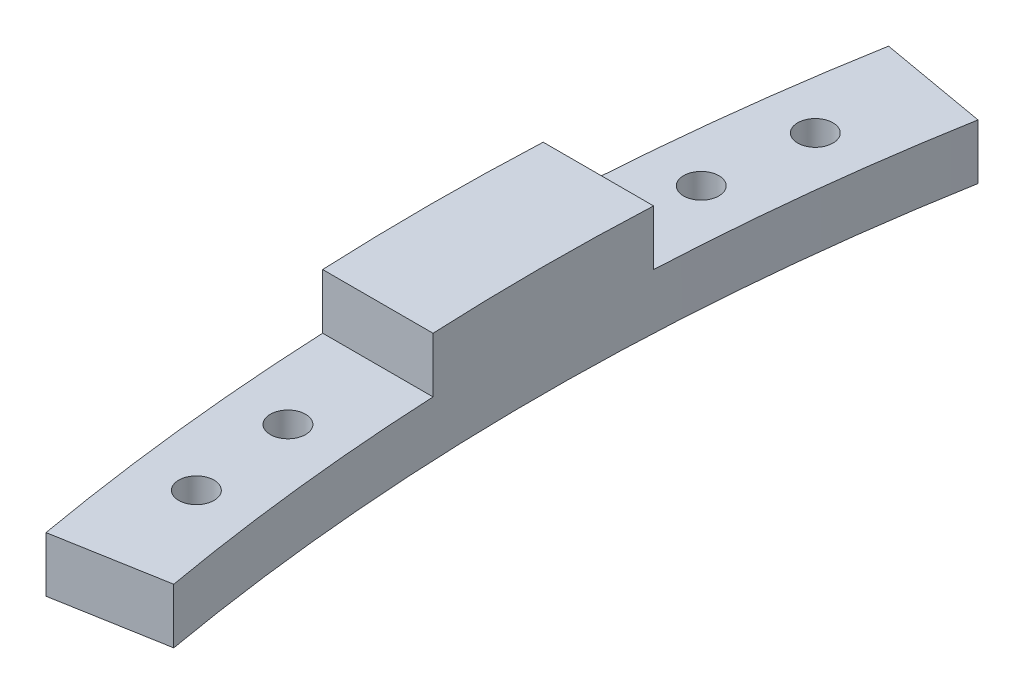
ISO-10303-21;
HEADER;
FILE_DESCRIPTION(('STEP AP214'),'2;1');
FILE_NAME('part.step','',(''),(''),'','','');
FILE_SCHEMA(('AUTOMOTIVE_DESIGN { 1 0 10303 214 1 1 1 1 }'));
ENDSEC;
DATA;
#1=APPLICATION_CONTEXT('core data for automotive mechanical design processes');
#2=APPLICATION_PROTOCOL_DEFINITION('international standard','automotive_design',2000,#1);
#3=PRODUCT_CONTEXT('',#1,'mechanical');
#4=PRODUCT('Part','Part','',(#3));
#5=PRODUCT_RELATED_PRODUCT_CATEGORY('part','',(#4));
#6=PRODUCT_DEFINITION_FORMATION('','',#4);
#7=PRODUCT_DEFINITION_CONTEXT('part definition',#1,'design');
#8=PRODUCT_DEFINITION('design','',#6,#7);
#9=PRODUCT_DEFINITION_SHAPE('','',#8);
#10=(LENGTH_UNIT() NAMED_UNIT(*) SI_UNIT(.MILLI.,.METRE.));
#11=(NAMED_UNIT(*) PLANE_ANGLE_UNIT() SI_UNIT($,.RADIAN.));
#12=(NAMED_UNIT(*) SI_UNIT($,.STERADIAN.) SOLID_ANGLE_UNIT());
#13=UNCERTAINTY_MEASURE_WITH_UNIT(LENGTH_MEASURE(1.E-05),#10,'distance_accuracy_value','');
#14=(GEOMETRIC_REPRESENTATION_CONTEXT(3) GLOBAL_UNCERTAINTY_ASSIGNED_CONTEXT((#13)) GLOBAL_UNIT_ASSIGNED_CONTEXT((#10,
#11,#12)) REPRESENTATION_CONTEXT('',''));
#15=CARTESIAN_POINT('',(0.,0.,0.));
#16=DIRECTION('',(0.,0.,1.));
#17=DIRECTION('',(1.,0.,0.));
#18=AXIS2_PLACEMENT_3D('',#15,#16,#17);
#19=CARTESIAN_POINT('',(0.,5.,0.));
#20=DIRECTION('',(0.,1.,0.));
#21=DIRECTION('',(0.,0.,1.));
#22=AXIS2_PLACEMENT_3D('',#19,#20,#21);
#23=PLANE('',#22);
#24=DIRECTION('',(-1.,0.,0.));
#25=VECTOR('',#24,1.);
#26=CARTESIAN_POINT('',(-219.772609758359,5.,-9.99999999999996));
#27=LINE('',#26,#25);
#28=CARTESIAN_POINT('',(-209.76176963403,5.,-9.99999999999996));
#29=VERTEX_POINT('',#28);
#30=CARTESIAN_POINT('',(-219.772609758359,5.,-9.99999999999996));
#31=VERTEX_POINT('',#30);
#32=EDGE_CURVE('E48',#29,#31,#27,.T.);
#33=ORIENTED_EDGE('',*,*,#32,.F.);
#34=CARTESIAN_POINT('',(0.,5.,0.));
#35=DIRECTION('',(0.,-1.,0.));
#36=DIRECTION('',(0.,0.,1.));
#37=AXIS2_PLACEMENT_3D('',#34,#35,#36);
#38=CIRCLE('',#37,210.);
#39=CARTESIAN_POINT('',(-206.809628132564,5.,-36.4661173100554));
#40=VERTEX_POINT('',#39);
#41=EDGE_CURVE('E155',#29,#40,#38,.T.);
#42=ORIENTED_EDGE('',*,*,#41,.T.);
#43=DIRECTION('',(-0.984807753012208,0.,-0.173648177666932));
#44=VECTOR('',#43,1.);
#45=CARTESIAN_POINT('',(-216.657705662686,5.,-38.2025990867247));
#46=LINE('',#45,#44);
#47=CARTESIAN_POINT('',(-216.657705662686,5.,-38.2025990867247));
#48=VERTEX_POINT('',#47);
#49=EDGE_CURVE('E158',#40,#48,#46,.T.);
#50=ORIENTED_EDGE('',*,*,#49,.T.);
#51=CARTESIAN_POINT('',(0.,5.,0.));
#52=DIRECTION('',(0.,1.,0.));
#53=DIRECTION('',(0.,0.,1.));
#54=AXIS2_PLACEMENT_3D('',#51,#52,#53);
#55=CIRCLE('',#54,220.);
#56=EDGE_CURVE('E151',#48,#31,#55,.T.);
#57=ORIENTED_EDGE('',*,*,#56,.T.);
#58=EDGE_LOOP('',(#33,#42,#50,#57));
#59=FACE_BOUND('',#58,.T.);
#60=CARTESIAN_POINT('',(-213.160645195369,5.,-28.0631313273112));
#61=DIRECTION('',(0.,-1.,0.));
#62=DIRECTION('',(0.,0.,-1.));
#63=AXIS2_PLACEMENT_3D('',#60,#61,#62);
#64=CIRCLE('',#63,1.59999999999999);
#65=CARTESIAN_POINT('',(-213.160645195369,5.,-29.6631313273112));
#66=VERTEX_POINT('',#65);
#67=EDGE_CURVE('E147',#66,#66,#64,.T.);
#68=ORIENTED_EDGE('',*,*,#67,.T.);
#69=EDGE_LOOP('',(#68));
#70=FACE_BOUND('',#69,.T.);
#71=CARTESIAN_POINT('',(-214.181860089725,5.,-18.7384846907466));
#72=DIRECTION('',(0.,-1.,0.));
#73=DIRECTION('',(0.,0.,-1.));
#74=AXIS2_PLACEMENT_3D('',#71,#72,#73);
#75=CIRCLE('',#74,1.59999999999999);
#76=CARTESIAN_POINT('',(-214.181860089725,5.,-20.3384846907466));
#77=VERTEX_POINT('',#76);
#78=EDGE_CURVE('E135',#77,#77,#75,.T.);
#79=ORIENTED_EDGE('',*,*,#78,.T.);
#80=EDGE_LOOP('',(#79));
#81=FACE_BOUND('',#80,.T.);
#82=ADVANCED_FACE('F33',(#59,#70,#81),#23,.T.);
#83=CARTESIAN_POINT('',(0.,5.,0.));
#84=DIRECTION('',(0.,-1.,0.));
#85=DIRECTION('',(0.,0.,-1.));
#86=AXIS2_PLACEMENT_3D('',#83,#84,#85);
#87=CYLINDRICAL_SURFACE('',#86,220.);
#88=CARTESIAN_POINT('',(0.,0.,0.));
#89=DIRECTION('',(0.,1.,0.));
#90=DIRECTION('',(0.,0.,1.));
#91=AXIS2_PLACEMENT_3D('',#88,#89,#90);
#92=CIRCLE('',#91,220.);
#93=CARTESIAN_POINT('',(-216.657705662686,0.,-38.2025990867247));
#94=VERTEX_POINT('',#93);
#95=CARTESIAN_POINT('',(-216.657705662686,0.,38.2025990867248));
#96=VERTEX_POINT('',#95);
#97=EDGE_CURVE('E150',#94,#96,#92,.T.);
#98=ORIENTED_EDGE('',*,*,#97,.T.);
#99=DIRECTION('',(0.,-1.,0.));
#100=VECTOR('',#99,1.);
#101=CARTESIAN_POINT('',(-216.657705662686,5.,38.2025990867248));
#102=LINE('',#101,#100);
#103=CARTESIAN_POINT('',(-216.657705662686,5.,38.2025990867248));
#104=VERTEX_POINT('',#103);
#105=EDGE_CURVE('E11',#104,#96,#102,.T.);
#106=ORIENTED_EDGE('',*,*,#105,.F.);
#107=CARTESIAN_POINT('',(-219.772609758359,5.,10.));
#108=VERTEX_POINT('',#107);
#109=EDGE_CURVE('E120',#108,#104,#55,.T.);
#110=ORIENTED_EDGE('',*,*,#109,.F.);
#111=DIRECTION('',(0.,-1.,0.));
#112=VECTOR('',#111,1.);
#113=CARTESIAN_POINT('',(-219.772609758359,10.,10.));
#114=LINE('',#113,#112);
#115=CARTESIAN_POINT('',(-219.772609758359,10.,10.));
#116=VERTEX_POINT('',#115);
#117=EDGE_CURVE('E102',#116,#108,#114,.T.);
#118=ORIENTED_EDGE('',*,*,#117,.F.);
#119=CARTESIAN_POINT('',(0.,10.,0.));
#120=DIRECTION('',(0.,1.,0.));
#121=DIRECTION('',(0.,0.,1.));
#122=AXIS2_PLACEMENT_3D('',#119,#120,#121);
#123=CIRCLE('',#122,220.);
#124=CARTESIAN_POINT('',(-219.772609758359,10.,-9.99999999999996));
#125=VERTEX_POINT('',#124);
#126=EDGE_CURVE('E108',#125,#116,#123,.T.);
#127=ORIENTED_EDGE('',*,*,#126,.F.);
#128=DIRECTION('',(0.,-1.,0.));
#129=VECTOR('',#128,1.);
#130=CARTESIAN_POINT('',(-219.772609758359,10.,-9.99999999999996));
#131=LINE('',#130,#129);
#132=EDGE_CURVE('E190',#125,#31,#131,.T.);
#133=ORIENTED_EDGE('',*,*,#132,.T.);
#134=ORIENTED_EDGE('',*,*,#56,.F.);
#135=DIRECTION('',(0.,-1.,0.));
#136=VECTOR('',#135,1.);
#137=CARTESIAN_POINT('',(-216.657705662686,5.,-38.2025990867247));
#138=LINE('',#137,#136);
#139=EDGE_CURVE('E160',#48,#94,#138,.T.);
#140=ORIENTED_EDGE('',*,*,#139,.T.);
#141=EDGE_LOOP('',(#98,#106,#110,#118,#127,#133,#134,#140));
#142=FACE_BOUND('',#141,.T.);
#143=ADVANCED_FACE('F35',(#142),#87,.T.);
#144=CARTESIAN_POINT('',(-206.809628132564,5.,36.4661173100555));
#145=DIRECTION('',(-0.173648177666932,0.,-0.984807753012208));
#146=DIRECTION('',(-0.984807753012208,0.,0.173648177666932));
#147=AXIS2_PLACEMENT_3D('',#144,#145,#146);
#148=PLANE('',#147);
#149=DIRECTION('',(0.984807753012208,0.,-0.173648177666932));
#150=VECTOR('',#149,1.);
#151=CARTESIAN_POINT('',(-206.809628132564,0.,36.4661173100555));
#152=LINE('',#151,#150);
#153=CARTESIAN_POINT('',(-206.809628132564,0.,36.4661173100555));
#154=VERTEX_POINT('',#153);
#155=EDGE_CURVE('E162',#96,#154,#152,.T.);
#156=ORIENTED_EDGE('',*,*,#155,.T.);
#157=DIRECTION('',(0.,-1.,0.));
#158=VECTOR('',#157,1.);
#159=CARTESIAN_POINT('',(-206.809628132564,5.,36.4661173100555));
#160=LINE('',#159,#158);
#161=CARTESIAN_POINT('',(-206.809628132564,5.,36.4661173100555));
#162=VERTEX_POINT('',#161);
#163=EDGE_CURVE('E41',#162,#154,#160,.T.);
#164=ORIENTED_EDGE('',*,*,#163,.F.);
#165=DIRECTION('',(0.984807753012208,0.,-0.173648177666932));
#166=VECTOR('',#165,1.);
#167=CARTESIAN_POINT('',(-206.809628132564,5.,36.4661173100555));
#168=LINE('',#167,#166);
#169=EDGE_CURVE('E153',#104,#162,#168,.T.);
#170=ORIENTED_EDGE('',*,*,#169,.F.);
#171=ORIENTED_EDGE('',*,*,#105,.T.);
#172=EDGE_LOOP('',(#156,#164,#170,#171));
#173=FACE_BOUND('',#172,.T.);
#174=ADVANCED_FACE('F216',(#173),#148,.F.);
#175=CARTESIAN_POINT('',(0.,5.,0.));
#176=DIRECTION('',(0.,-1.,0.));
#177=DIRECTION('',(0.,0.,-1.));
#178=AXIS2_PLACEMENT_3D('',#175,#176,#177);
#179=CYLINDRICAL_SURFACE('',#178,210.);
#180=CARTESIAN_POINT('',(0.,0.,0.));
#181=DIRECTION('',(0.,-1.,0.));
#182=DIRECTION('',(0.,0.,1.));
#183=AXIS2_PLACEMENT_3D('',#180,#181,#182);
#184=CIRCLE('',#183,210.);
#185=CARTESIAN_POINT('',(-206.809628132564,0.,-36.4661173100554));
#186=VERTEX_POINT('',#185);
#187=EDGE_CURVE('E164',#154,#186,#184,.T.);
#188=ORIENTED_EDGE('',*,*,#187,.T.);
#189=DIRECTION('',(0.,-1.,0.));
#190=VECTOR('',#189,1.);
#191=CARTESIAN_POINT('',(-206.809628132564,5.,-36.4661173100554));
#192=LINE('',#191,#190);
#193=EDGE_CURVE('E170',#40,#186,#192,.T.);
#194=ORIENTED_EDGE('',*,*,#193,.F.);
#195=ORIENTED_EDGE('',*,*,#41,.F.);
#196=DIRECTION('',(0.,-1.,0.));
#197=VECTOR('',#196,1.);
#198=CARTESIAN_POINT('',(-209.76176963403,10.,-10.0000000000001));
#199=LINE('',#198,#197);
#200=CARTESIAN_POINT('',(-209.76176963403,10.,-10.0000000000001));
#201=VERTEX_POINT('',#200);
#202=EDGE_CURVE('E126',#201,#29,#199,.T.);
#203=ORIENTED_EDGE('',*,*,#202,.F.);
#204=CARTESIAN_POINT('',(0.,10.,0.));
#205=DIRECTION('',(0.,-1.,0.));
#206=DIRECTION('',(0.,0.,1.));
#207=AXIS2_PLACEMENT_3D('',#204,#205,#206);
#208=CIRCLE('',#207,210.);
#209=CARTESIAN_POINT('',(-209.76176963403,10.,10.));
#210=VERTEX_POINT('',#209);
#211=EDGE_CURVE('E107',#210,#201,#208,.T.);
#212=ORIENTED_EDGE('',*,*,#211,.F.);
#213=DIRECTION('',(0.,-1.,0.));
#214=VECTOR('',#213,1.);
#215=CARTESIAN_POINT('',(-209.76176963403,10.,10.));
#216=LINE('',#215,#214);
#217=CARTESIAN_POINT('',(-209.76176963403,5.,10.));
#218=VERTEX_POINT('',#217);
#219=EDGE_CURVE('E104',#210,#218,#216,.T.);
#220=ORIENTED_EDGE('',*,*,#219,.T.);
#221=EDGE_CURVE('E156',#162,#218,#38,.T.);
#222=ORIENTED_EDGE('',*,*,#221,.F.);
#223=ORIENTED_EDGE('',*,*,#163,.T.);
#224=EDGE_LOOP('',(#188,#194,#195,#203,#212,#220,#222,#223));
#225=FACE_BOUND('',#224,.T.);
#226=ADVANCED_FACE('F177',(#225),#179,.F.);
#227=CARTESIAN_POINT('',(-216.657705662686,5.,-38.2025990867247));
#228=DIRECTION('',(-0.173648177666932,0.,0.984807753012208));
#229=DIRECTION('',(0.984807753012208,0.,0.173648177666932));
#230=AXIS2_PLACEMENT_3D('',#227,#228,#229);
#231=PLANE('',#230);
#232=DIRECTION('',(-0.984807753012208,0.,-0.173648177666932));
#233=VECTOR('',#232,1.);
#234=CARTESIAN_POINT('',(-216.657705662686,0.,-38.2025990867247));
#235=LINE('',#234,#233);
#236=EDGE_CURVE('E166',#186,#94,#235,.T.);
#237=ORIENTED_EDGE('',*,*,#236,.T.);
#238=ORIENTED_EDGE('',*,*,#139,.F.);
#239=ORIENTED_EDGE('',*,*,#49,.F.);
#240=ORIENTED_EDGE('',*,*,#193,.T.);
#241=EDGE_LOOP('',(#237,#238,#239,#240));
#242=FACE_BOUND('',#241,.T.);
#243=ADVANCED_FACE('F187',(#242),#231,.F.);
#244=DIRECTION('',(1.,0.,0.));
#245=VECTOR('',#244,1.);
#246=CARTESIAN_POINT('',(-219.772609758359,5.,10.));
#247=LINE('',#246,#245);
#248=EDGE_CURVE('E56',#108,#218,#247,.T.);
#249=ORIENTED_EDGE('',*,*,#248,.F.);
#250=ORIENTED_EDGE('',*,*,#109,.T.);
#251=ORIENTED_EDGE('',*,*,#169,.T.);
#252=ORIENTED_EDGE('',*,*,#221,.T.);
#253=EDGE_LOOP('',(#249,#250,#251,#252));
#254=FACE_BOUND('',#253,.T.);
#255=CARTESIAN_POINT('',(-214.181860089725,5.,18.7384846907465));
#256=DIRECTION('',(0.,-1.,0.));
#257=DIRECTION('',(0.,0.,-1.));
#258=AXIS2_PLACEMENT_3D('',#255,#256,#257);
#259=CIRCLE('',#258,1.59999999999999);
#260=CARTESIAN_POINT('',(-214.181860089725,5.,17.1384846907466));
#261=VERTEX_POINT('',#260);
#262=EDGE_CURVE('E124',#261,#261,#259,.T.);
#263=ORIENTED_EDGE('',*,*,#262,.T.);
#264=EDGE_LOOP('',(#263));
#265=FACE_BOUND('',#264,.T.);
#266=CARTESIAN_POINT('',(-213.160645195369,5.,28.0631313273111));
#267=DIRECTION('',(0.,-1.,0.));
#268=DIRECTION('',(0.,0.,-1.));
#269=AXIS2_PLACEMENT_3D('',#266,#267,#268);
#270=CIRCLE('',#269,1.59999999999999);
#271=CARTESIAN_POINT('',(-213.160645195369,5.,26.4631313273111));
#272=VERTEX_POINT('',#271);
#273=EDGE_CURVE('E141',#272,#272,#270,.T.);
#274=ORIENTED_EDGE('',*,*,#273,.T.);
#275=EDGE_LOOP('',(#274));
#276=FACE_BOUND('',#275,.T.);
#277=ADVANCED_FACE('F212',(#254,#265,#276),#23,.T.);
#278=CARTESIAN_POINT('',(0.,0.,0.));
#279=DIRECTION('',(0.,1.,0.));
#280=DIRECTION('',(0.,0.,1.));
#281=AXIS2_PLACEMENT_3D('',#278,#279,#280);
#282=PLANE('',#281);
#283=CARTESIAN_POINT('',(-214.181860089725,0.,18.7384846907465));
#284=DIRECTION('',(0.,-1.,0.));
#285=DIRECTION('',(0.,0.,-1.));
#286=AXIS2_PLACEMENT_3D('',#283,#284,#285);
#287=CIRCLE('',#286,1.59999999999999);
#288=CARTESIAN_POINT('',(-214.181860089725,0.,17.1384846907466));
#289=VERTEX_POINT('',#288);
#290=EDGE_CURVE('E121',#289,#289,#287,.T.);
#291=ORIENTED_EDGE('',*,*,#290,.F.);
#292=EDGE_LOOP('',(#291));
#293=FACE_BOUND('',#292,.T.);
#294=CARTESIAN_POINT('',(-214.181860089725,0.,-18.7384846907466));
#295=DIRECTION('',(0.,-1.,0.));
#296=DIRECTION('',(0.,0.,-1.));
#297=AXIS2_PLACEMENT_3D('',#294,#295,#296);
#298=CIRCLE('',#297,1.59999999999999);
#299=CARTESIAN_POINT('',(-214.181860089725,0.,-20.3384846907466));
#300=VERTEX_POINT('',#299);
#301=EDGE_CURVE('E132',#300,#300,#298,.T.);
#302=ORIENTED_EDGE('',*,*,#301,.F.);
#303=EDGE_LOOP('',(#302));
#304=FACE_BOUND('',#303,.T.);
#305=CARTESIAN_POINT('',(-213.160645195369,0.,28.0631313273111));
#306=DIRECTION('',(0.,-1.,0.));
#307=DIRECTION('',(0.,0.,-1.));
#308=AXIS2_PLACEMENT_3D('',#305,#306,#307);
#309=CIRCLE('',#308,1.59999999999999);
#310=CARTESIAN_POINT('',(-213.160645195369,0.,26.4631313273111));
#311=VERTEX_POINT('',#310);
#312=EDGE_CURVE('E138',#311,#311,#309,.T.);
#313=ORIENTED_EDGE('',*,*,#312,.F.);
#314=EDGE_LOOP('',(#313));
#315=FACE_BOUND('',#314,.T.);
#316=CARTESIAN_POINT('',(-213.160645195369,0.,-28.0631313273112));
#317=DIRECTION('',(0.,-1.,0.));
#318=DIRECTION('',(0.,0.,-1.));
#319=AXIS2_PLACEMENT_3D('',#316,#317,#318);
#320=CIRCLE('',#319,1.59999999999999);
#321=CARTESIAN_POINT('',(-213.160645195369,0.,-29.6631313273112));
#322=VERTEX_POINT('',#321);
#323=EDGE_CURVE('E144',#322,#322,#320,.T.);
#324=ORIENTED_EDGE('',*,*,#323,.F.);
#325=EDGE_LOOP('',(#324));
#326=FACE_BOUND('',#325,.T.);
#327=ORIENTED_EDGE('',*,*,#97,.F.);
#328=ORIENTED_EDGE('',*,*,#236,.F.);
#329=ORIENTED_EDGE('',*,*,#187,.F.);
#330=ORIENTED_EDGE('',*,*,#155,.F.);
#331=EDGE_LOOP('',(#327,#328,#329,#330));
#332=FACE_BOUND('',#331,.T.);
#333=ADVANCED_FACE('F184',(#293,#304,#315,#326,#332),#282,.F.);
#334=CARTESIAN_POINT('',(-213.160645195369,0.,-28.0631313273112));
#335=DIRECTION('',(0.,-1.,0.));
#336=DIRECTION('',(0.,0.,-1.));
#337=AXIS2_PLACEMENT_3D('',#334,#335,#336);
#338=CYLINDRICAL_SURFACE('',#337,1.59999999999999);
#339=ORIENTED_EDGE('',*,*,#67,.F.);
#340=EDGE_LOOP('',(#339));
#341=FACE_BOUND('',#340,.T.);
#342=ORIENTED_EDGE('',*,*,#323,.T.);
#343=EDGE_LOOP('',(#342));
#344=FACE_BOUND('',#343,.T.);
#345=ADVANCED_FACE('F224',(#341,#344),#338,.F.);
#346=CARTESIAN_POINT('',(-213.160645195369,0.,28.0631313273111));
#347=DIRECTION('',(0.,-1.,0.));
#348=DIRECTION('',(0.,0.,-1.));
#349=AXIS2_PLACEMENT_3D('',#346,#347,#348);
#350=CYLINDRICAL_SURFACE('',#349,1.59999999999999);
#351=ORIENTED_EDGE('',*,*,#273,.F.);
#352=EDGE_LOOP('',(#351));
#353=FACE_BOUND('',#352,.T.);
#354=ORIENTED_EDGE('',*,*,#312,.T.);
#355=EDGE_LOOP('',(#354));
#356=FACE_BOUND('',#355,.T.);
#357=ADVANCED_FACE('F232',(#353,#356),#350,.F.);
#358=CARTESIAN_POINT('',(-214.181860089725,0.,-18.7384846907466));
#359=DIRECTION('',(0.,-1.,0.));
#360=DIRECTION('',(0.,0.,-1.));
#361=AXIS2_PLACEMENT_3D('',#358,#359,#360);
#362=CYLINDRICAL_SURFACE('',#361,1.59999999999999);
#363=ORIENTED_EDGE('',*,*,#78,.F.);
#364=EDGE_LOOP('',(#363));
#365=FACE_BOUND('',#364,.T.);
#366=ORIENTED_EDGE('',*,*,#301,.T.);
#367=EDGE_LOOP('',(#366));
#368=FACE_BOUND('',#367,.T.);
#369=ADVANCED_FACE('F235',(#365,#368),#362,.F.);
#370=CARTESIAN_POINT('',(-214.181860089725,0.,18.7384846907465));
#371=DIRECTION('',(0.,-1.,0.));
#372=DIRECTION('',(0.,0.,-1.));
#373=AXIS2_PLACEMENT_3D('',#370,#371,#372);
#374=CYLINDRICAL_SURFACE('',#373,1.59999999999999);
#375=ORIENTED_EDGE('',*,*,#262,.F.);
#376=EDGE_LOOP('',(#375));
#377=FACE_BOUND('',#376,.T.);
#378=ORIENTED_EDGE('',*,*,#290,.T.);
#379=EDGE_LOOP('',(#378));
#380=FACE_BOUND('',#379,.T.);
#381=ADVANCED_FACE('F208',(#377,#380),#374,.F.);
#382=CARTESIAN_POINT('',(-219.772609758359,10.,10.));
#383=DIRECTION('',(0.,0.,-1.));
#384=DIRECTION('',(-1.,0.,0.));
#385=AXIS2_PLACEMENT_3D('',#382,#383,#384);
#386=PLANE('',#385);
#387=ORIENTED_EDGE('',*,*,#248,.T.);
#388=ORIENTED_EDGE('',*,*,#219,.F.);
#389=DIRECTION('',(1.,0.,0.));
#390=VECTOR('',#389,1.);
#391=CARTESIAN_POINT('',(-219.772609758359,10.,10.));
#392=LINE('',#391,#390);
#393=EDGE_CURVE('E98',#116,#210,#392,.T.);
#394=ORIENTED_EDGE('',*,*,#393,.F.);
#395=ORIENTED_EDGE('',*,*,#117,.T.);
#396=EDGE_LOOP('',(#387,#388,#394,#395));
#397=FACE_BOUND('',#396,.T.);
#398=ADVANCED_FACE('F100',(#397),#386,.F.);
#399=CARTESIAN_POINT('',(-219.772609758359,10.,-9.99999999999996));
#400=DIRECTION('',(0.,0.,1.));
#401=DIRECTION('',(1.,0.,0.));
#402=AXIS2_PLACEMENT_3D('',#399,#400,#401);
#403=PLANE('',#402);
#404=ORIENTED_EDGE('',*,*,#32,.T.);
#405=ORIENTED_EDGE('',*,*,#132,.F.);
#406=DIRECTION('',(-1.,0.,0.));
#407=VECTOR('',#406,1.);
#408=CARTESIAN_POINT('',(-219.772609758359,10.,-9.99999999999996));
#409=LINE('',#408,#407);
#410=EDGE_CURVE('E113',#201,#125,#409,.T.);
#411=ORIENTED_EDGE('',*,*,#410,.F.);
#412=ORIENTED_EDGE('',*,*,#202,.T.);
#413=EDGE_LOOP('',(#404,#405,#411,#412));
#414=FACE_BOUND('',#413,.T.);
#415=ADVANCED_FACE('F194',(#414),#403,.F.);
#416=CARTESIAN_POINT('',(0.,10.,0.));
#417=DIRECTION('',(0.,1.,0.));
#418=DIRECTION('',(0.,0.,1.));
#419=AXIS2_PLACEMENT_3D('',#416,#417,#418);
#420=PLANE('',#419);
#421=ORIENTED_EDGE('',*,*,#126,.T.);
#422=ORIENTED_EDGE('',*,*,#393,.T.);
#423=ORIENTED_EDGE('',*,*,#211,.T.);
#424=ORIENTED_EDGE('',*,*,#410,.T.);
#425=EDGE_LOOP('',(#421,#422,#423,#424));
#426=FACE_BOUND('',#425,.T.);
#427=ADVANCED_FACE('F111',(#426),#420,.T.);
#428=CLOSED_SHELL('',(#82,#143,#174,#226,#243,#277,#333,#345,#357,#369,#381,#398,#415,#427));
#429=MANIFOLD_SOLID_BREP('B2',#428);
#430=ADVANCED_BREP_SHAPE_REPRESENTATION('',(#18,#429),#14);
#431=SHAPE_DEFINITION_REPRESENTATION(#9,#430);
ENDSEC;
END-ISO-10303-21;
